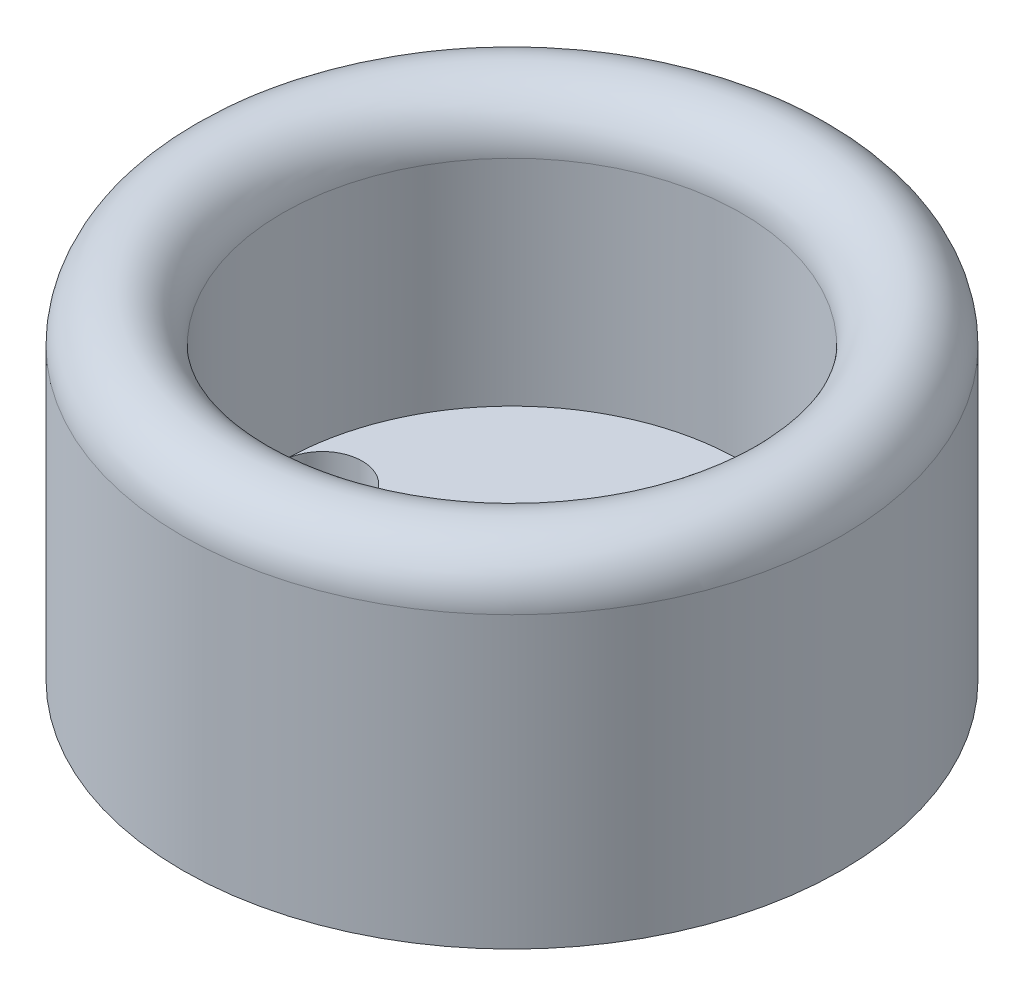
ISO-10303-21;
HEADER;
FILE_DESCRIPTION(('STEP AP214'),'2;1');
FILE_NAME('part.step','',(''),(''),'','','');
FILE_SCHEMA(('AUTOMOTIVE_DESIGN { 1 0 10303 214 1 1 1 1 }'));
ENDSEC;
DATA;
#1=APPLICATION_CONTEXT('core data for automotive mechanical design processes');
#2=APPLICATION_PROTOCOL_DEFINITION('international standard','automotive_design',2000,#1);
#3=PRODUCT_CONTEXT('',#1,'mechanical');
#4=PRODUCT('Part','Part','',(#3));
#5=PRODUCT_RELATED_PRODUCT_CATEGORY('part','',(#4));
#6=PRODUCT_DEFINITION_FORMATION('','',#4);
#7=PRODUCT_DEFINITION_CONTEXT('part definition',#1,'design');
#8=PRODUCT_DEFINITION('design','',#6,#7);
#9=PRODUCT_DEFINITION_SHAPE('','',#8);
#10=(LENGTH_UNIT() NAMED_UNIT(*) SI_UNIT(.MILLI.,.METRE.));
#11=(NAMED_UNIT(*) PLANE_ANGLE_UNIT() SI_UNIT($,.RADIAN.));
#12=(NAMED_UNIT(*) SI_UNIT($,.STERADIAN.) SOLID_ANGLE_UNIT());
#13=UNCERTAINTY_MEASURE_WITH_UNIT(LENGTH_MEASURE(1.E-05),#10,'distance_accuracy_value','');
#14=(GEOMETRIC_REPRESENTATION_CONTEXT(3) GLOBAL_UNCERTAINTY_ASSIGNED_CONTEXT((#13)) GLOBAL_UNIT_ASSIGNED_CONTEXT((#10,
#11,#12)) REPRESENTATION_CONTEXT('',''));
#15=CARTESIAN_POINT('',(0.,0.,0.));
#16=DIRECTION('',(0.,0.,1.));
#17=DIRECTION('',(1.,0.,0.));
#18=AXIS2_PLACEMENT_3D('',#15,#16,#17);
#19=CARTESIAN_POINT('',(0.,29.,0.));
#20=DIRECTION('',(0.,1.,0.));
#21=DIRECTION('',(0.,0.,1.));
#22=AXIS2_PLACEMENT_3D('',#19,#20,#21);
#23=TOROIDAL_SURFACE('',#22,28.,5.);
#24=CARTESIAN_POINT('',(0.,29.,0.));
#25=DIRECTION('',(0.,1.,0.));
#26=DIRECTION('',(0.,0.,1.));
#27=AXIS2_PLACEMENT_3D('',#24,#25,#26);
#28=CIRCLE('',#27,33.);
#29=CARTESIAN_POINT('',(0.,29.,33.));
#30=VERTEX_POINT('',#29);
#31=EDGE_CURVE('E56',#30,#30,#28,.F.);
#32=ORIENTED_EDGE('',*,*,#31,.F.);
#33=EDGE_LOOP('',(#32));
#34=FACE_BOUND('',#33,.T.);
#35=CARTESIAN_POINT('',(0.,29.,0.));
#36=DIRECTION('',(0.,1.,0.));
#37=DIRECTION('',(0.,0.,1.));
#38=AXIS2_PLACEMENT_3D('',#35,#36,#37);
#39=CIRCLE('',#38,23.);
#40=CARTESIAN_POINT('',(0.,29.,23.));
#41=VERTEX_POINT('',#40);
#42=EDGE_CURVE('E11',#41,#41,#39,.T.);
#43=ORIENTED_EDGE('',*,*,#42,.F.);
#44=EDGE_LOOP('',(#43));
#45=FACE_BOUND('',#44,.T.);
#46=ADVANCED_FACE('F47',(#34,#45),#23,.T.);
#47=CARTESIAN_POINT('',(0.,7.5,0.));
#48=DIRECTION('',(0.,1.,0.));
#49=DIRECTION('',(0.,0.,1.));
#50=AXIS2_PLACEMENT_3D('',#47,#48,#49);
#51=PLANE('',#50);
#52=CARTESIAN_POINT('',(0.,7.5,0.));
#53=DIRECTION('',(0.,1.,0.));
#54=DIRECTION('',(0.,0.,1.));
#55=AXIS2_PLACEMENT_3D('',#52,#53,#54);
#56=CIRCLE('',#55,5.5);
#57=CARTESIAN_POINT('',(0.,7.5,5.5));
#58=VERTEX_POINT('',#57);
#59=EDGE_CURVE('E95',#58,#58,#56,.T.);
#60=ORIENTED_EDGE('',*,*,#59,.F.);
#61=EDGE_LOOP('',(#60));
#62=FACE_BOUND('',#61,.T.);
#63=CARTESIAN_POINT('',(19.,7.5,0.));
#64=DIRECTION('',(0.,1.,0.));
#65=DIRECTION('',(0.,0.,1.));
#66=AXIS2_PLACEMENT_3D('',#63,#64,#65);
#67=CIRCLE('',#66,4.);
#68=CARTESIAN_POINT('',(23.,7.5,0.));
#69=VERTEX_POINT('',#68);
#70=EDGE_CURVE('E76',#69,#69,#67,.T.);
#71=ORIENTED_EDGE('',*,*,#70,.F.);
#72=CARTESIAN_POINT('',(0.,7.5,0.));
#73=DIRECTION('',(0.,1.,0.));
#74=DIRECTION('',(0.,0.,1.));
#75=AXIS2_PLACEMENT_3D('',#72,#73,#74);
#76=CIRCLE('',#75,23.);
#77=CARTESIAN_POINT('',(-23.,7.5,0.));
#78=VERTEX_POINT('',#77);
#79=EDGE_CURVE('E62',#69,#78,#76,.T.);
#80=ORIENTED_EDGE('',*,*,#79,.T.);
#81=CARTESIAN_POINT('',(-19.,7.5,0.));
#82=DIRECTION('',(0.,1.,0.));
#83=DIRECTION('',(0.,0.,1.));
#84=AXIS2_PLACEMENT_3D('',#81,#82,#83);
#85=CIRCLE('',#84,4.);
#86=EDGE_CURVE('E75',#78,#78,#85,.T.);
#87=ORIENTED_EDGE('',*,*,#86,.F.);
#88=EDGE_CURVE('E64',#78,#69,#76,.T.);
#89=ORIENTED_EDGE('',*,*,#88,.T.);
#90=EDGE_LOOP('',(#71,#80,#87,#89));
#91=FACE_BOUND('',#90,.T.);
#92=ADVANCED_FACE('F74',(#62,#91),#51,.T.);
#93=CARTESIAN_POINT('',(-19.,7.5,0.));
#94=DIRECTION('',(0.,-1.,0.));
#95=DIRECTION('',(0.,0.,-1.));
#96=AXIS2_PLACEMENT_3D('',#93,#94,#95);
#97=CYLINDRICAL_SURFACE('',#96,1.8);
#98=CARTESIAN_POINT('',(-19.,0.,0.));
#99=DIRECTION('',(0.,1.,0.));
#100=DIRECTION('',(0.,0.,1.));
#101=AXIS2_PLACEMENT_3D('',#98,#99,#100);
#102=CIRCLE('',#101,1.8);
#103=CARTESIAN_POINT('',(-19.,0.,1.8));
#104=VERTEX_POINT('',#103);
#105=EDGE_CURVE('E71',#104,#104,#102,.T.);
#106=ORIENTED_EDGE('',*,*,#105,.F.);
#107=EDGE_LOOP('',(#106));
#108=FACE_BOUND('',#107,.T.);
#109=CARTESIAN_POINT('',(-19.,1.5,0.));
#110=DIRECTION('',(0.,1.,0.));
#111=DIRECTION('',(0.,0.,1.));
#112=AXIS2_PLACEMENT_3D('',#109,#110,#111);
#113=CIRCLE('',#112,1.8);
#114=CARTESIAN_POINT('',(-19.,1.5,1.8));
#115=VERTEX_POINT('',#114);
#116=EDGE_CURVE('E104',#115,#115,#113,.T.);
#117=ORIENTED_EDGE('',*,*,#116,.T.);
#118=EDGE_LOOP('',(#117));
#119=FACE_BOUND('',#118,.T.);
#120=ADVANCED_FACE('F158',(#108,#119),#97,.F.);
#121=CARTESIAN_POINT('',(19.,7.5,0.));
#122=DIRECTION('',(0.,-1.,0.));
#123=DIRECTION('',(0.,0.,-1.));
#124=AXIS2_PLACEMENT_3D('',#121,#122,#123);
#125=CYLINDRICAL_SURFACE('',#124,1.8);
#126=CARTESIAN_POINT('',(19.,0.,0.));
#127=DIRECTION('',(0.,1.,0.));
#128=DIRECTION('',(0.,0.,-1.));
#129=AXIS2_PLACEMENT_3D('',#126,#127,#128);
#130=CIRCLE('',#129,1.8);
#131=CARTESIAN_POINT('',(19.,0.,-1.80000000000001));
#132=VERTEX_POINT('',#131);
#133=EDGE_CURVE('E99',#132,#132,#130,.T.);
#134=ORIENTED_EDGE('',*,*,#133,.F.);
#135=EDGE_LOOP('',(#134));
#136=FACE_BOUND('',#135,.T.);
#137=CARTESIAN_POINT('',(19.,1.5,0.));
#138=DIRECTION('',(0.,1.,0.));
#139=DIRECTION('',(0.,0.,1.));
#140=AXIS2_PLACEMENT_3D('',#137,#138,#139);
#141=CIRCLE('',#140,1.8);
#142=CARTESIAN_POINT('',(19.,1.5,1.8));
#143=VERTEX_POINT('',#142);
#144=EDGE_CURVE('E88',#143,#143,#141,.T.);
#145=ORIENTED_EDGE('',*,*,#144,.T.);
#146=EDGE_LOOP('',(#145));
#147=FACE_BOUND('',#146,.T.);
#148=ADVANCED_FACE('F155',(#136,#147),#125,.F.);
#149=CARTESIAN_POINT('',(0.,0.,0.));
#150=DIRECTION('',(0.,1.,0.));
#151=DIRECTION('',(0.,0.,1.));
#152=AXIS2_PLACEMENT_3D('',#149,#150,#151);
#153=PLANE('',#152);
#154=CARTESIAN_POINT('',(0.,0.,0.));
#155=DIRECTION('',(0.,-1.,0.));
#156=DIRECTION('',(0.,0.,-1.));
#157=AXIS2_PLACEMENT_3D('',#154,#155,#156);
#158=CIRCLE('',#157,33.);
#159=CARTESIAN_POINT('',(0.,0.,-33.));
#160=VERTEX_POINT('',#159);
#161=EDGE_CURVE('E79',#160,#160,#158,.T.);
#162=ORIENTED_EDGE('',*,*,#161,.T.);
#163=EDGE_LOOP('',(#162));
#164=FACE_BOUND('',#163,.T.);
#165=CARTESIAN_POINT('',(0.,0.,0.));
#166=DIRECTION('',(0.,1.,0.));
#167=DIRECTION('',(0.,0.,1.));
#168=AXIS2_PLACEMENT_3D('',#165,#166,#167);
#169=CIRCLE('',#168,5.5);
#170=CARTESIAN_POINT('',(0.,0.,5.5));
#171=VERTEX_POINT('',#170);
#172=EDGE_CURVE('E100',#171,#171,#169,.T.);
#173=ORIENTED_EDGE('',*,*,#172,.T.);
#174=EDGE_LOOP('',(#173));
#175=FACE_BOUND('',#174,.T.);
#176=ORIENTED_EDGE('',*,*,#133,.T.);
#177=EDGE_LOOP('',(#176));
#178=FACE_BOUND('',#177,.T.);
#179=ORIENTED_EDGE('',*,*,#105,.T.);
#180=EDGE_LOOP('',(#179));
#181=FACE_BOUND('',#180,.T.);
#182=ADVANCED_FACE('F153',(#164,#175,#178,#181),#153,.F.);
#183=CARTESIAN_POINT('',(0.,7.5,0.));
#184=DIRECTION('',(0.,-1.,0.));
#185=DIRECTION('',(0.,0.,-1.));
#186=AXIS2_PLACEMENT_3D('',#183,#184,#185);
#187=CYLINDRICAL_SURFACE('',#186,5.5);
#188=ORIENTED_EDGE('',*,*,#59,.T.);
#189=EDGE_LOOP('',(#188));
#190=FACE_BOUND('',#189,.T.);
#191=ORIENTED_EDGE('',*,*,#172,.F.);
#192=EDGE_LOOP('',(#191));
#193=FACE_BOUND('',#192,.T.);
#194=ADVANCED_FACE('F146',(#190,#193),#187,.F.);
#195=CARTESIAN_POINT('',(19.,1.5,0.));
#196=DIRECTION('',(0.,1.,0.));
#197=DIRECTION('',(0.,0.,1.));
#198=AXIS2_PLACEMENT_3D('',#195,#196,#197);
#199=CYLINDRICAL_SURFACE('',#198,4.);
#200=CARTESIAN_POINT('',(19.,1.5,0.));
#201=DIRECTION('',(0.,1.,0.));
#202=DIRECTION('',(0.,0.,1.));
#203=AXIS2_PLACEMENT_3D('',#200,#201,#202);
#204=CIRCLE('',#203,4.);
#205=CARTESIAN_POINT('',(19.,1.5,3.99999999999999));
#206=VERTEX_POINT('',#205);
#207=EDGE_CURVE('E78',#206,#206,#204,.T.);
#208=ORIENTED_EDGE('',*,*,#207,.F.);
#209=EDGE_LOOP('',(#208));
#210=FACE_BOUND('',#209,.T.);
#211=ORIENTED_EDGE('',*,*,#70,.T.);
#212=EDGE_LOOP('',(#211));
#213=FACE_BOUND('',#212,.T.);
#214=ADVANCED_FACE('F143',(#210,#213),#199,.F.);
#215=CARTESIAN_POINT('',(19.,1.5,0.));
#216=DIRECTION('',(0.,1.,0.));
#217=DIRECTION('',(0.,0.,1.));
#218=AXIS2_PLACEMENT_3D('',#215,#216,#217);
#219=PLANE('',#218);
#220=ORIENTED_EDGE('',*,*,#144,.F.);
#221=EDGE_LOOP('',(#220));
#222=FACE_BOUND('',#221,.T.);
#223=ORIENTED_EDGE('',*,*,#207,.T.);
#224=EDGE_LOOP('',(#223));
#225=FACE_BOUND('',#224,.T.);
#226=ADVANCED_FACE('F141',(#222,#225),#219,.T.);
#227=CARTESIAN_POINT('',(-19.,1.5,0.));
#228=DIRECTION('',(0.,1.,0.));
#229=DIRECTION('',(0.,0.,1.));
#230=AXIS2_PLACEMENT_3D('',#227,#228,#229);
#231=CYLINDRICAL_SURFACE('',#230,4.);
#232=CARTESIAN_POINT('',(-19.,1.5,0.));
#233=DIRECTION('',(0.,1.,0.));
#234=DIRECTION('',(0.,0.,1.));
#235=AXIS2_PLACEMENT_3D('',#232,#233,#234);
#236=CIRCLE('',#235,4.);
#237=CARTESIAN_POINT('',(-19.,1.5,4.));
#238=VERTEX_POINT('',#237);
#239=EDGE_CURVE('E83',#238,#238,#236,.T.);
#240=ORIENTED_EDGE('',*,*,#239,.F.);
#241=EDGE_LOOP('',(#240));
#242=FACE_BOUND('',#241,.T.);
#243=ORIENTED_EDGE('',*,*,#86,.T.);
#244=EDGE_LOOP('',(#243));
#245=FACE_BOUND('',#244,.T.);
#246=ADVANCED_FACE('F81',(#242,#245),#231,.F.);
#247=CARTESIAN_POINT('',(-19.,1.5,0.));
#248=DIRECTION('',(0.,1.,0.));
#249=DIRECTION('',(0.,0.,1.));
#250=AXIS2_PLACEMENT_3D('',#247,#248,#249);
#251=PLANE('',#250);
#252=ORIENTED_EDGE('',*,*,#116,.F.);
#253=EDGE_LOOP('',(#252));
#254=FACE_BOUND('',#253,.T.);
#255=ORIENTED_EDGE('',*,*,#239,.T.);
#256=EDGE_LOOP('',(#255));
#257=FACE_BOUND('',#256,.T.);
#258=ADVANCED_FACE('F133',(#254,#257),#251,.T.);
#259=CARTESIAN_POINT('',(0.,34.,0.));
#260=DIRECTION('',(0.,-1.,0.));
#261=DIRECTION('',(0.,0.,-1.));
#262=AXIS2_PLACEMENT_3D('',#259,#260,#261);
#263=CYLINDRICAL_SURFACE('',#262,33.);
#264=ORIENTED_EDGE('',*,*,#31,.T.);
#265=EDGE_LOOP('',(#264));
#266=FACE_BOUND('',#265,.T.);
#267=ORIENTED_EDGE('',*,*,#161,.F.);
#268=EDGE_LOOP('',(#267));
#269=FACE_BOUND('',#268,.T.);
#270=ADVANCED_FACE('F120',(#266,#269),#263,.T.);
#271=CARTESIAN_POINT('',(0.,34.,0.));
#272=DIRECTION('',(0.,-1.,0.));
#273=DIRECTION('',(0.,0.,-1.));
#274=AXIS2_PLACEMENT_3D('',#271,#272,#273);
#275=CYLINDRICAL_SURFACE('',#274,23.);
#276=ORIENTED_EDGE('',*,*,#42,.T.);
#277=EDGE_LOOP('',(#276));
#278=FACE_BOUND('',#277,.T.);
#279=ORIENTED_EDGE('',*,*,#79,.F.);
#280=ORIENTED_EDGE('',*,*,#88,.F.);
#281=EDGE_LOOP('',(#279,#280));
#282=FACE_BOUND('',#281,.T.);
#283=ADVANCED_FACE('F65',(#278,#282),#275,.F.);
#284=CLOSED_SHELL('',(#46,#92,#120,#148,#182,#194,#214,#226,#246,#258,#270,#283));
#285=MANIFOLD_SOLID_BREP('B2',#284);
#286=ADVANCED_BREP_SHAPE_REPRESENTATION('',(#18,#285),#14);
#287=SHAPE_DEFINITION_REPRESENTATION(#9,#286);
ENDSEC;
END-ISO-10303-21;
